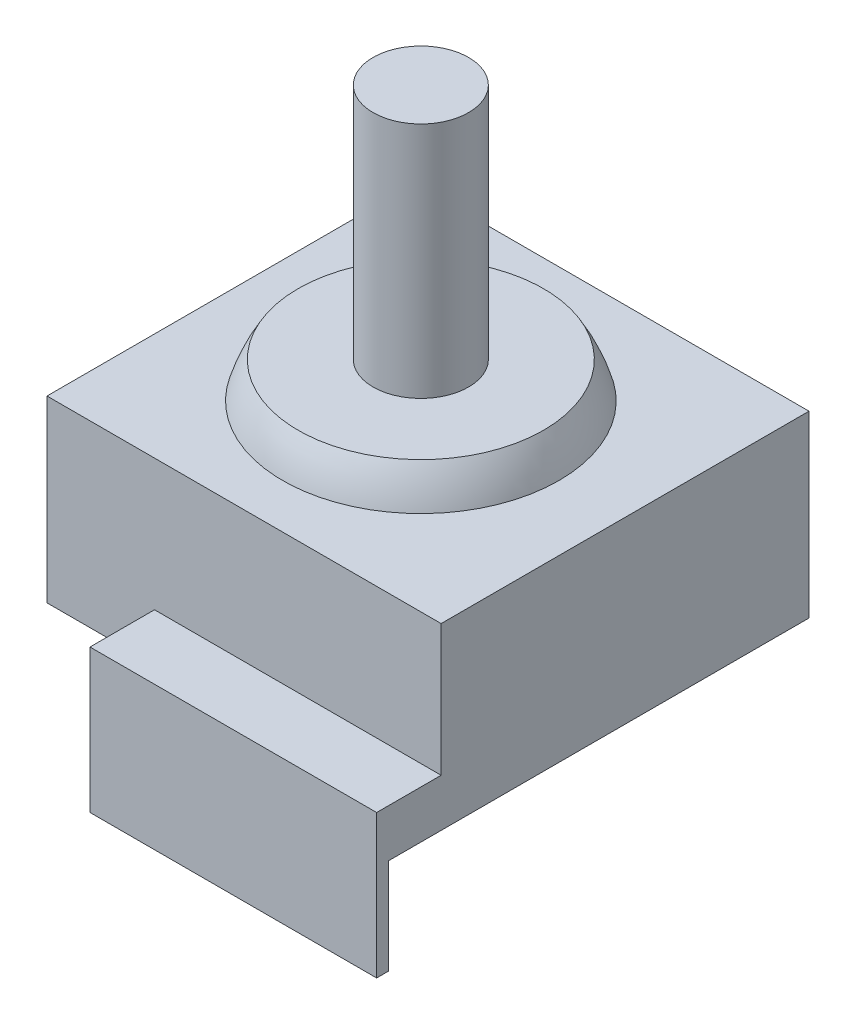
ISO-10303-21;
HEADER;
FILE_DESCRIPTION(('STEP AP214'),'2;1');
FILE_NAME('part.step','',(''),(''),'','','');
FILE_SCHEMA(('AUTOMOTIVE_DESIGN { 1 0 10303 214 1 1 1 1 }'));
ENDSEC;
DATA;
#1=APPLICATION_CONTEXT('core data for automotive mechanical design processes');
#2=APPLICATION_PROTOCOL_DEFINITION('international standard','automotive_design',2000,#1);
#3=PRODUCT_CONTEXT('',#1,'mechanical');
#4=PRODUCT('Part','Part','',(#3));
#5=PRODUCT_RELATED_PRODUCT_CATEGORY('part','',(#4));
#6=PRODUCT_DEFINITION_FORMATION('','',#4);
#7=PRODUCT_DEFINITION_CONTEXT('part definition',#1,'design');
#8=PRODUCT_DEFINITION('design','',#6,#7);
#9=PRODUCT_DEFINITION_SHAPE('','',#8);
#10=(LENGTH_UNIT() NAMED_UNIT(*) SI_UNIT(.MILLI.,.METRE.));
#11=(NAMED_UNIT(*) PLANE_ANGLE_UNIT() SI_UNIT($,.RADIAN.));
#12=(NAMED_UNIT(*) SI_UNIT($,.STERADIAN.) SOLID_ANGLE_UNIT());
#13=UNCERTAINTY_MEASURE_WITH_UNIT(LENGTH_MEASURE(1.E-05),#10,'distance_accuracy_value','');
#14=(GEOMETRIC_REPRESENTATION_CONTEXT(3) GLOBAL_UNCERTAINTY_ASSIGNED_CONTEXT((#13)) GLOBAL_UNIT_ASSIGNED_CONTEXT((#10,
#11,#12)) REPRESENTATION_CONTEXT('',''));
#15=CARTESIAN_POINT('',(0.,0.,0.));
#16=DIRECTION('',(0.,0.,1.));
#17=DIRECTION('',(1.,0.,0.));
#18=AXIS2_PLACEMENT_3D('',#15,#16,#17);
#19=CARTESIAN_POINT('',(-8.,7.5,7.65));
#20=DIRECTION('',(0.,0.,-1.));
#21=DIRECTION('',(-1.,0.,0.));
#22=AXIS2_PLACEMENT_3D('',#19,#20,#21);
#23=PLANE('',#22);
#24=DIRECTION('',(0.,-1.,0.));
#25=VECTOR('',#24,1.);
#26=CARTESIAN_POINT('',(-3.5,2.,7.65));
#27=LINE('',#26,#25);
#28=CARTESIAN_POINT('',(-3.5,2.,7.65));
#29=VERTEX_POINT('',#28);
#30=CARTESIAN_POINT('',(-3.5,0.,7.65));
#31=VERTEX_POINT('',#30);
#32=EDGE_CURVE('E117',#29,#31,#27,.T.);
#33=ORIENTED_EDGE('',*,*,#32,.F.);
#34=DIRECTION('',(1.,0.,0.));
#35=VECTOR('',#34,1.);
#36=CARTESIAN_POINT('',(8.5,2.,7.65));
#37=LINE('',#36,#35);
#38=CARTESIAN_POINT('',(8.5,2.,7.65));
#39=VERTEX_POINT('',#38);
#40=EDGE_CURVE('E153',#29,#39,#37,.T.);
#41=ORIENTED_EDGE('',*,*,#40,.T.);
#42=DIRECTION('',(0.,-1.,0.));
#43=VECTOR('',#42,1.);
#44=CARTESIAN_POINT('',(8.5,7.5,7.65));
#45=LINE('',#44,#43);
#46=CARTESIAN_POINT('',(8.5,7.5,7.65));
#47=VERTEX_POINT('',#46);
#48=EDGE_CURVE('E187',#47,#39,#45,.T.);
#49=ORIENTED_EDGE('',*,*,#48,.F.);
#50=DIRECTION('',(1.,0.,0.));
#51=VECTOR('',#50,1.);
#52=CARTESIAN_POINT('',(-8.,7.5,7.65));
#53=LINE('',#52,#51);
#54=CARTESIAN_POINT('',(-8.,7.5,7.65));
#55=VERTEX_POINT('',#54);
#56=EDGE_CURVE('E167',#55,#47,#53,.T.);
#57=ORIENTED_EDGE('',*,*,#56,.F.);
#58=DIRECTION('',(0.,-1.,0.));
#59=VECTOR('',#58,1.);
#60=CARTESIAN_POINT('',(-8.,7.5,7.65));
#61=LINE('',#60,#59);
#62=CARTESIAN_POINT('',(-8.,0.,7.65));
#63=VERTEX_POINT('',#62);
#64=EDGE_CURVE('E46',#55,#63,#61,.T.);
#65=ORIENTED_EDGE('',*,*,#64,.T.);
#66=DIRECTION('',(1.,0.,0.));
#67=VECTOR('',#66,1.);
#68=CARTESIAN_POINT('',(-8.,0.,7.65));
#69=LINE('',#68,#67);
#70=EDGE_CURVE('E177',#63,#31,#69,.T.);
#71=ORIENTED_EDGE('',*,*,#70,.T.);
#72=EDGE_LOOP('',(#33,#41,#49,#57,#65,#71));
#73=FACE_BOUND('',#72,.T.);
#74=ADVANCED_FACE('F37',(#73),#23,.F.);
#75=CARTESIAN_POINT('',(0.,7.5,0.));
#76=DIRECTION('',(0.,-1.,0.));
#77=DIRECTION('',(0.,0.,-1.));
#78=AXIS2_PLACEMENT_3D('',#75,#76,#77);
#79=PLANE('',#78);
#80=CARTESIAN_POINT('',(0.,7.5,0.));
#81=DIRECTION('',(0.,-1.,0.));
#82=DIRECTION('',(0.,0.,-1.));
#83=AXIS2_PLACEMENT_3D('',#80,#81,#82);
#84=CIRCLE('',#83,5.78273291792038);
#85=CARTESIAN_POINT('',(5.78273291792038,7.5,0.));
#86=VERTEX_POINT('',#85);
#87=EDGE_CURVE('E41',#86,#86,#84,.T.);
#88=ORIENTED_EDGE('',*,*,#87,.T.);
#89=EDGE_LOOP('',(#88));
#90=FACE_BOUND('',#89,.T.);
#91=DIRECTION('',(0.,0.,1.));
#92=VECTOR('',#91,1.);
#93=CARTESIAN_POINT('',(-8.,7.5,7.65));
#94=LINE('',#93,#92);
#95=CARTESIAN_POINT('',(-8.,7.5,-7.75));
#96=VERTEX_POINT('',#95);
#97=EDGE_CURVE('E164',#96,#55,#94,.T.);
#98=ORIENTED_EDGE('',*,*,#97,.T.);
#99=ORIENTED_EDGE('',*,*,#56,.T.);
#100=DIRECTION('',(0.,0.,-1.));
#101=VECTOR('',#100,1.);
#102=CARTESIAN_POINT('',(8.5,7.5,7.65));
#103=LINE('',#102,#101);
#104=CARTESIAN_POINT('',(8.5,7.5,-7.75));
#105=VERTEX_POINT('',#104);
#106=EDGE_CURVE('E170',#47,#105,#103,.T.);
#107=ORIENTED_EDGE('',*,*,#106,.T.);
#108=DIRECTION('',(-1.,0.,0.));
#109=VECTOR('',#108,1.);
#110=CARTESIAN_POINT('',(-8.,7.5,-7.75));
#111=LINE('',#110,#109);
#112=EDGE_CURVE('E172',#105,#96,#111,.T.);
#113=ORIENTED_EDGE('',*,*,#112,.T.);
#114=EDGE_LOOP('',(#98,#99,#107,#113));
#115=FACE_BOUND('',#114,.T.);
#116=ADVANCED_FACE('F219',(#90,#115),#79,.F.);
#117=CARTESIAN_POINT('',(0.,0.,0.));
#118=DIRECTION('',(0.,-1.,0.));
#119=DIRECTION('',(0.,0.,-1.));
#120=AXIS2_PLACEMENT_3D('',#117,#118,#119);
#121=PLANE('',#120);
#122=DIRECTION('',(1.,0.,0.));
#123=VECTOR('',#122,1.);
#124=CARTESIAN_POINT('',(0.,0.,9.85));
#125=LINE('',#124,#123);
#126=CARTESIAN_POINT('',(-3.5,0.,9.85));
#127=VERTEX_POINT('',#126);
#128=CARTESIAN_POINT('',(8.5,0.,9.85));
#129=VERTEX_POINT('',#128);
#130=EDGE_CURVE('E57',#127,#129,#125,.T.);
#131=ORIENTED_EDGE('',*,*,#130,.F.);
#132=DIRECTION('',(0.,0.,-1.));
#133=VECTOR('',#132,1.);
#134=CARTESIAN_POINT('',(-3.5,0.,7.65));
#135=LINE('',#134,#133);
#136=EDGE_CURVE('E147',#127,#31,#135,.T.);
#137=ORIENTED_EDGE('',*,*,#136,.T.);
#138=ORIENTED_EDGE('',*,*,#70,.F.);
#139=DIRECTION('',(0.,0.,1.));
#140=VECTOR('',#139,1.);
#141=CARTESIAN_POINT('',(-8.,0.,7.65));
#142=LINE('',#141,#140);
#143=CARTESIAN_POINT('',(-8.,0.,-7.75));
#144=VERTEX_POINT('',#143);
#145=EDGE_CURVE('E163',#144,#63,#142,.T.);
#146=ORIENTED_EDGE('',*,*,#145,.F.);
#147=DIRECTION('',(-1.,0.,0.));
#148=VECTOR('',#147,1.);
#149=CARTESIAN_POINT('',(-8.,0.,-7.75));
#150=LINE('',#149,#148);
#151=CARTESIAN_POINT('',(8.5,0.,-7.75));
#152=VERTEX_POINT('',#151);
#153=EDGE_CURVE('E168',#152,#144,#150,.T.);
#154=ORIENTED_EDGE('',*,*,#153,.F.);
#155=DIRECTION('',(0.,0.,-1.));
#156=VECTOR('',#155,1.);
#157=CARTESIAN_POINT('',(8.5,0.,7.65));
#158=LINE('',#157,#156);
#159=EDGE_CURVE('E53',#129,#152,#158,.T.);
#160=ORIENTED_EDGE('',*,*,#159,.F.);
#161=EDGE_LOOP('',(#131,#137,#138,#146,#154,#160));
#162=FACE_BOUND('',#161,.T.);
#163=CARTESIAN_POINT('',(0.,0.,0.));
#164=DIRECTION('',(0.,1.,0.));
#165=DIRECTION('',(0.,0.,1.));
#166=AXIS2_PLACEMENT_3D('',#163,#164,#165);
#167=CIRCLE('',#166,0.5);
#168=CARTESIAN_POINT('',(0.,0.,0.5));
#169=VERTEX_POINT('',#168);
#170=EDGE_CURVE('E158',#169,#169,#167,.T.);
#171=ORIENTED_EDGE('',*,*,#170,.T.);
#172=EDGE_LOOP('',(#171));
#173=FACE_BOUND('',#172,.T.);
#174=ADVANCED_FACE('F225',(#162,#173),#121,.T.);
#175=CARTESIAN_POINT('',(-8.,7.5,7.65));
#176=DIRECTION('',(1.,0.,0.));
#177=DIRECTION('',(0.,0.,-1.));
#178=AXIS2_PLACEMENT_3D('',#175,#176,#177);
#179=PLANE('',#178);
#180=ORIENTED_EDGE('',*,*,#145,.T.);
#181=ORIENTED_EDGE('',*,*,#64,.F.);
#182=ORIENTED_EDGE('',*,*,#97,.F.);
#183=DIRECTION('',(0.,-1.,0.));
#184=VECTOR('',#183,1.);
#185=CARTESIAN_POINT('',(-8.,7.5,-7.75));
#186=LINE('',#185,#184);
#187=EDGE_CURVE('E174',#96,#144,#186,.T.);
#188=ORIENTED_EDGE('',*,*,#187,.T.);
#189=EDGE_LOOP('',(#180,#181,#182,#188));
#190=FACE_BOUND('',#189,.T.);
#191=ADVANCED_FACE('F39',(#190),#179,.F.);
#192=CARTESIAN_POINT('',(8.5,7.5,7.65));
#193=DIRECTION('',(-1.,0.,0.));
#194=DIRECTION('',(0.,0.,1.));
#195=AXIS2_PLACEMENT_3D('',#192,#193,#194);
#196=PLANE('',#195);
#197=DIRECTION('',(0.,0.,1.));
#198=VECTOR('',#197,1.);
#199=CARTESIAN_POINT('',(8.5,2.,7.65));
#200=LINE('',#199,#198);
#201=CARTESIAN_POINT('',(8.5,2.,10.35));
#202=VERTEX_POINT('',#201);
#203=EDGE_CURVE('E148',#39,#202,#200,.T.);
#204=ORIENTED_EDGE('',*,*,#203,.T.);
#205=DIRECTION('',(0.,-1.,0.));
#206=VECTOR('',#205,1.);
#207=CARTESIAN_POINT('',(8.5,2.,10.35));
#208=LINE('',#207,#206);
#209=CARTESIAN_POINT('',(8.5,-4.,10.35));
#210=VERTEX_POINT('',#209);
#211=EDGE_CURVE('E118',#202,#210,#208,.T.);
#212=ORIENTED_EDGE('',*,*,#211,.T.);
#213=DIRECTION('',(0.,0.,-1.));
#214=VECTOR('',#213,1.);
#215=CARTESIAN_POINT('',(8.5,-4.,10.35));
#216=LINE('',#215,#214);
#217=CARTESIAN_POINT('',(8.5,-4.,9.85));
#218=VERTEX_POINT('',#217);
#219=EDGE_CURVE('E128',#210,#218,#216,.T.);
#220=ORIENTED_EDGE('',*,*,#219,.T.);
#221=DIRECTION('',(0.,1.,0.));
#222=VECTOR('',#221,1.);
#223=CARTESIAN_POINT('',(8.5,-4.,9.85));
#224=LINE('',#223,#222);
#225=EDGE_CURVE('E142',#218,#129,#224,.T.);
#226=ORIENTED_EDGE('',*,*,#225,.T.);
#227=ORIENTED_EDGE('',*,*,#159,.T.);
#228=DIRECTION('',(0.,-1.,0.));
#229=VECTOR('',#228,1.);
#230=CARTESIAN_POINT('',(8.5,7.5,-7.75));
#231=LINE('',#230,#229);
#232=EDGE_CURVE('E184',#105,#152,#231,.T.);
#233=ORIENTED_EDGE('',*,*,#232,.F.);
#234=ORIENTED_EDGE('',*,*,#106,.F.);
#235=ORIENTED_EDGE('',*,*,#48,.T.);
#236=EDGE_LOOP('',(#204,#212,#220,#226,#227,#233,#234,#235));
#237=FACE_BOUND('',#236,.T.);
#238=ADVANCED_FACE('F230',(#237),#196,.F.);
#239=CARTESIAN_POINT('',(-8.,7.5,-7.75));
#240=DIRECTION('',(0.,0.,1.));
#241=DIRECTION('',(1.,0.,0.));
#242=AXIS2_PLACEMENT_3D('',#239,#240,#241);
#243=PLANE('',#242);
#244=ORIENTED_EDGE('',*,*,#153,.T.);
#245=ORIENTED_EDGE('',*,*,#187,.F.);
#246=ORIENTED_EDGE('',*,*,#112,.F.);
#247=ORIENTED_EDGE('',*,*,#232,.T.);
#248=EDGE_LOOP('',(#244,#245,#246,#247));
#249=FACE_BOUND('',#248,.T.);
#250=ADVANCED_FACE('F233',(#249),#243,.F.);
#251=CARTESIAN_POINT('',(0.,7.5,0.));
#252=DIRECTION('',(0.,-1.,0.));
#253=DIRECTION('',(0.,0.,-1.));
#254=AXIS2_PLACEMENT_3D('',#251,#252,#253);
#255=CYLINDRICAL_SURFACE('',#254,0.5);
#256=CARTESIAN_POINT('',(0.,5.9,0.));
#257=DIRECTION('',(0.,-1.,0.));
#258=DIRECTION('',(0.,0.,-1.));
#259=AXIS2_PLACEMENT_3D('',#256,#257,#258);
#260=CIRCLE('',#259,0.5);
#261=CARTESIAN_POINT('',(0.,5.9,-0.5));
#262=VERTEX_POINT('',#261);
#263=EDGE_CURVE('E11',#262,#262,#260,.T.);
#264=ORIENTED_EDGE('',*,*,#263,.F.);
#265=EDGE_LOOP('',(#264));
#266=FACE_BOUND('',#265,.T.);
#267=ORIENTED_EDGE('',*,*,#170,.F.);
#268=EDGE_LOOP('',(#267));
#269=FACE_BOUND('',#268,.T.);
#270=ADVANCED_FACE('F237',(#266,#269),#255,.F.);
#271=CARTESIAN_POINT('',(-3.5,2.,7.65));
#272=DIRECTION('',(-1.,0.,0.));
#273=DIRECTION('',(0.,0.,1.));
#274=AXIS2_PLACEMENT_3D('',#271,#272,#273);
#275=PLANE('',#274);
#276=ORIENTED_EDGE('',*,*,#136,.F.);
#277=DIRECTION('',(0.,1.,0.));
#278=VECTOR('',#277,1.);
#279=CARTESIAN_POINT('',(-3.5,-4.,9.85));
#280=LINE('',#279,#278);
#281=CARTESIAN_POINT('',(-3.5,-4.,9.85));
#282=VERTEX_POINT('',#281);
#283=EDGE_CURVE('E132',#282,#127,#280,.T.);
#284=ORIENTED_EDGE('',*,*,#283,.F.);
#285=DIRECTION('',(0.,0.,1.));
#286=VECTOR('',#285,1.);
#287=CARTESIAN_POINT('',(-3.5,-4.,10.35));
#288=LINE('',#287,#286);
#289=CARTESIAN_POINT('',(-3.5,-4.,10.35));
#290=VERTEX_POINT('',#289);
#291=EDGE_CURVE('E125',#282,#290,#288,.T.);
#292=ORIENTED_EDGE('',*,*,#291,.T.);
#293=DIRECTION('',(0.,-1.,0.));
#294=VECTOR('',#293,1.);
#295=CARTESIAN_POINT('',(-3.5,2.,10.35));
#296=LINE('',#295,#294);
#297=CARTESIAN_POINT('',(-3.5,2.,10.35));
#298=VERTEX_POINT('',#297);
#299=EDGE_CURVE('E107',#298,#290,#296,.T.);
#300=ORIENTED_EDGE('',*,*,#299,.F.);
#301=DIRECTION('',(0.,0.,-1.));
#302=VECTOR('',#301,1.);
#303=CARTESIAN_POINT('',(-3.5,2.,7.65));
#304=LINE('',#303,#302);
#305=EDGE_CURVE('E151',#298,#29,#304,.T.);
#306=ORIENTED_EDGE('',*,*,#305,.T.);
#307=ORIENTED_EDGE('',*,*,#32,.T.);
#308=EDGE_LOOP('',(#276,#284,#292,#300,#306,#307));
#309=FACE_BOUND('',#308,.T.);
#310=ADVANCED_FACE('F130',(#309),#275,.T.);
#311=CARTESIAN_POINT('',(8.5,2.,10.35));
#312=DIRECTION('',(0.,0.,1.));
#313=DIRECTION('',(1.,0.,0.));
#314=AXIS2_PLACEMENT_3D('',#311,#312,#313);
#315=PLANE('',#314);
#316=ORIENTED_EDGE('',*,*,#299,.T.);
#317=DIRECTION('',(1.,0.,0.));
#318=VECTOR('',#317,1.);
#319=CARTESIAN_POINT('',(-3.5,-4.,10.35));
#320=LINE('',#319,#318);
#321=EDGE_CURVE('E111',#290,#210,#320,.T.);
#322=ORIENTED_EDGE('',*,*,#321,.T.);
#323=ORIENTED_EDGE('',*,*,#211,.F.);
#324=DIRECTION('',(-1.,0.,0.));
#325=VECTOR('',#324,1.);
#326=CARTESIAN_POINT('',(8.5,2.,10.35));
#327=LINE('',#326,#325);
#328=EDGE_CURVE('E113',#202,#298,#327,.T.);
#329=ORIENTED_EDGE('',*,*,#328,.T.);
#330=EDGE_LOOP('',(#316,#322,#323,#329));
#331=FACE_BOUND('',#330,.T.);
#332=ADVANCED_FACE('F109',(#331),#315,.T.);
#333=CARTESIAN_POINT('',(0.,2.,0.));
#334=DIRECTION('',(0.,-1.,0.));
#335=DIRECTION('',(0.,0.,-1.));
#336=AXIS2_PLACEMENT_3D('',#333,#334,#335);
#337=PLANE('',#336);
#338=ORIENTED_EDGE('',*,*,#40,.F.);
#339=ORIENTED_EDGE('',*,*,#305,.F.);
#340=ORIENTED_EDGE('',*,*,#328,.F.);
#341=ORIENTED_EDGE('',*,*,#203,.F.);
#342=EDGE_LOOP('',(#338,#339,#340,#341));
#343=FACE_BOUND('',#342,.T.);
#344=ADVANCED_FACE('F246',(#343),#337,.F.);
#345=CARTESIAN_POINT('',(-3.5,-4.,9.85));
#346=DIRECTION('',(0.,0.,-1.));
#347=DIRECTION('',(-1.,0.,0.));
#348=AXIS2_PLACEMENT_3D('',#345,#346,#347);
#349=PLANE('',#348);
#350=ORIENTED_EDGE('',*,*,#283,.T.);
#351=ORIENTED_EDGE('',*,*,#130,.T.);
#352=ORIENTED_EDGE('',*,*,#225,.F.);
#353=DIRECTION('',(-1.,0.,0.));
#354=VECTOR('',#353,1.);
#355=CARTESIAN_POINT('',(-3.5,-4.,9.85));
#356=LINE('',#355,#354);
#357=EDGE_CURVE('E140',#218,#282,#356,.T.);
#358=ORIENTED_EDGE('',*,*,#357,.T.);
#359=EDGE_LOOP('',(#350,#351,#352,#358));
#360=FACE_BOUND('',#359,.T.);
#361=ADVANCED_FACE('F215',(#360),#349,.T.);
#362=CARTESIAN_POINT('',(0.,-4.,0.));
#363=DIRECTION('',(0.,-1.,0.));
#364=DIRECTION('',(0.,0.,-1.));
#365=AXIS2_PLACEMENT_3D('',#362,#363,#364);
#366=PLANE('',#365);
#367=ORIENTED_EDGE('',*,*,#291,.F.);
#368=ORIENTED_EDGE('',*,*,#357,.F.);
#369=ORIENTED_EDGE('',*,*,#219,.F.);
#370=ORIENTED_EDGE('',*,*,#321,.F.);
#371=EDGE_LOOP('',(#367,#368,#369,#370));
#372=FACE_BOUND('',#371,.T.);
#373=ADVANCED_FACE('F123',(#372),#366,.T.);
#374=CARTESIAN_POINT('',(0.,9.,0.));
#375=DIRECTION('',(0.,1.,0.));
#376=DIRECTION('',(0.,0.,1.));
#377=AXIS2_PLACEMENT_3D('',#374,#375,#376);
#378=PLANE('',#377);
#379=CARTESIAN_POINT('',(0.,9.,0.));
#380=DIRECTION('',(0.,1.,0.));
#381=DIRECTION('',(0.,0.,1.));
#382=AXIS2_PLACEMENT_3D('',#379,#380,#381);
#383=CIRCLE('',#382,2.);
#384=CARTESIAN_POINT('',(0.,9.,2.));
#385=VERTEX_POINT('',#384);
#386=EDGE_CURVE('E192',#385,#385,#383,.T.);
#387=ORIENTED_EDGE('',*,*,#386,.F.);
#388=EDGE_LOOP('',(#387));
#389=FACE_BOUND('',#388,.T.);
#390=CARTESIAN_POINT('',(0.,9.,0.));
#391=DIRECTION('',(0.,-1.,0.));
#392=DIRECTION('',(0.,0.,-1.));
#393=AXIS2_PLACEMENT_3D('',#390,#391,#392);
#394=CIRCLE('',#393,5.13711981561653);
#395=CARTESIAN_POINT('',(5.13711981561653,9.,0.));
#396=VERTEX_POINT('',#395);
#397=EDGE_CURVE('E194',#396,#396,#394,.T.);
#398=ORIENTED_EDGE('',*,*,#397,.F.);
#399=EDGE_LOOP('',(#398));
#400=FACE_BOUND('',#399,.T.);
#401=ADVANCED_FACE('F204',(#389,#400),#378,.T.);
#402=CARTESIAN_POINT('',(0.,5.9,0.));
#403=DIRECTION('',(0.,-1.,0.));
#404=DIRECTION('',(1.,0.,0.));
#405=AXIS2_PLACEMENT_3D('',#402,#403,#404);
#406=SPHERICAL_SURFACE('',#405,6.);
#407=CARTESIAN_POINT('',(5.13711981561653,9.,0.));
#408=CARTESIAN_POINT('',(5.14593609870219,8.98539022867018,0.));
#409=CARTESIAN_POINT('',(5.15469005412287,8.97074284568255,0.));
#410=CARTESIAN_POINT('',(5.1720726796035,8.94137392687018,0.));
#411=CARTESIAN_POINT('',(5.18070134966345,8.92665239104544,0.));
#412=CARTESIAN_POINT('',(5.19783277439181,8.89713623703743,0.));
#413=CARTESIAN_POINT('',(5.20633552906023,8.88234161885415,0.));
#414=CARTESIAN_POINT('',(5.22321450458411,8.85268037737378,0.));
#415=CARTESIAN_POINT('',(5.23159072543958,8.83781375407668,0.));
#416=CARTESIAN_POINT('',(5.24821602347208,8.80800958446732,0.));
#417=CARTESIAN_POINT('',(5.25646510064912,8.79307203815505,0.));
#418=CARTESIAN_POINT('',(5.27283551088986,8.76312710988048,0.));
#419=CARTESIAN_POINT('',(5.28095684395357,8.74811972791817,0.));
#420=CARTESIAN_POINT('',(5.29707117478458,8.71803622076438,0.));
#421=CARTESIAN_POINT('',(5.30506417255187,8.70296009557289,0.));
#422=CARTESIAN_POINT('',(5.32092125096143,8.67274019939302,0.));
#423=CARTESIAN_POINT('',(5.32878533160368,8.65759642840464,0.));
#424=CARTESIAN_POINT('',(5.34438400331538,8.62724234298541,0.));
#425=CARTESIAN_POINT('',(5.35211859438481,8.61203202855456,0.));
#426=CARTESIAN_POINT('',(5.36745772392986,8.5815459634492,0.));
#427=CARTESIAN_POINT('',(5.37506226240548,8.56627021277471,0.));
#428=CARTESIAN_POINT('',(5.39014073320853,8.53565438714401,0.));
#429=CARTESIAN_POINT('',(5.39761466553596,8.52031431218782,0.));
#430=CARTESIAN_POINT('',(5.41243137999551,8.48957095463807,0.));
#431=CARTESIAN_POINT('',(5.41977416212762,8.47416767204451,0.));
#432=CARTESIAN_POINT('',(5.43432804169614,8.4432990204654,0.));
#433=CARTESIAN_POINT('',(5.44153913913254,8.42783365147984,0.));
#434=CARTESIAN_POINT('',(5.45582912439493,8.39684195288154,0.));
#435=CARTESIAN_POINT('',(5.46290801222091,8.38131562326879,0.));
#436=CARTESIAN_POINT('',(5.47693306297164,8.35020313361837,0.));
#437=CARTESIAN_POINT('',(5.48387922589638,8.33461697358071,0.));
#438=CARTESIAN_POINT('',(5.49763832121519,8.30338595763797,0.));
#439=CARTESIAN_POINT('',(5.50445125360926,8.2877411017329,0.));
#440=CARTESIAN_POINT('',(5.51794339193549,8.25639383288547,0.));
#441=CARTESIAN_POINT('',(5.52462259786765,8.2406914199431,0.));
#442=CARTESIAN_POINT('',(5.53784679707314,8.20923018004095,0.));
#443=CARTESIAN_POINT('',(5.54439179034647,8.19347135308115,0.));
#444=CARTESIAN_POINT('',(5.55734708780705,8.1618984322705,0.));
#445=CARTESIAN_POINT('',(5.5637573919943,8.14608433841965,0.));
#446=CARTESIAN_POINT('',(5.57644284465985,8.11440203497629,0.));
#447=CARTESIAN_POINT('',(5.58271799313816,8.09853382538378,0.));
#448=CARTESIAN_POINT('',(5.59513267760131,8.06674444554572,0.));
#449=CARTESIAN_POINT('',(5.60127221358614,8.05082327530018,0.));
#450=CARTESIAN_POINT('',(5.61341522614941,8.01892913309983,0.));
#451=CARTESIAN_POINT('',(5.61941870272784,8.00295616114503,0.));
#452=CARTESIAN_POINT('',(5.63128915946946,7.97095957824071,0.));
#453=CARTESIAN_POINT('',(5.63715613963265,7.9549359672912,0.));
#454=CARTESIAN_POINT('',(5.64875317647096,7.92283927279818,0.));
#455=CARTESIAN_POINT('',(5.65448323314608,7.90676618925467,0.));
#456=CARTESIAN_POINT('',(5.66580600590217,7.87457171957553,0.));
#457=CARTESIAN_POINT('',(5.67139872198315,7.8584503334399,0.));
#458=CARTESIAN_POINT('',(5.68244640644327,7.82616043209477,0.));
#459=CARTESIAN_POINT('',(5.68790137482241,7.80999191688526,0.));
#460=CARTESIAN_POINT('',(5.69867316679442,7.77760893434018,0.));
#461=CARTESIAN_POINT('',(5.70398999038729,7.7613944670046,0.));
#462=CARTESIAN_POINT('',(5.71448510577231,7.72892076050419,0.));
#463=CARTESIAN_POINT('',(5.71966339756445,7.71266152133935,0.));
#464=CARTESIAN_POINT('',(5.72988107236516,7.68009945472127,0.));
#465=CARTESIAN_POINT('',(5.73492045537372,7.66379662726803,0.));
#466=CARTESIAN_POINT('',(5.74485994593192,7.63114857084293,0.));
#467=CARTESIAN_POINT('',(5.74976005348157,7.61480334187108,0.));
#468=CARTESIAN_POINT('',(5.75942063585329,7.58207167205594,0.));
#469=CARTESIAN_POINT('',(5.76418111067537,7.56568523121265,0.));
#470=CARTESIAN_POINT('',(5.77356208321776,7.53287233108226,0.));
#471=CARTESIAN_POINT('',(5.77818258093806,7.51644587179517,0.));
#472=CARTESIAN_POINT('',(5.78273291792038,7.5,0.));
#473=B_SPLINE_CURVE_WITH_KNOTS('',3,(#407,#408,#409,#410,#411,#412,#413,#414,#415,#416,#417,
#418,#419,#420,#421,#422,#423,#424,#425,#426,#427,#428,#429,#430,#431,#432,#433,#434,#435,#436,
#437,#438,#439,#440,#441,#442,#443,#444,#445,#446,#447,#448,#449,#450,#451,#452,#453,#454,#455,
#456,#457,#458,#459,#460,#461,#462,#463,#464,#465,#466,#467,#468,#469,#470,#471,#472),
.UNSPECIFIED.,.F.,.F.,(4,2,2,2,2,2,2,2,2,2,2,2,2,2,2,2,2,2,2,2,2,2,2,2,2,2,2,2,2,2,2,2,4),(0.,
0.0511911563702004,0.102382312740401,0.1535734691106,0.2047646254808,0.255955781851,
0.307146938221199,0.3583380945914,0.4095292509616,0.4607204073318,0.511911563701998,
0.5631027200722,0.614293876442399,0.665485032812599,0.716676189182798,0.767867345552999,
0.819058501923198,0.870249658293399,0.921440814663598,0.972631971033798,1.023823127404,
1.0750142837742,1.1262054401444,1.1773965965146,1.2285877528848,1.279778909255,1.3309700656252,
1.3821612219954,1.4333523783656,1.4845435347358,1.535734691106,1.5869258474762,1.6381170038464),.UNSPECIFIED.);
#474=EDGE_CURVE('BSEAM201',#396,#86,#473,.T.);
#475=ORIENTED_EDGE('',*,*,#397,.T.);
#476=ORIENTED_EDGE('',*,*,#87,.F.);
#477=ORIENTED_EDGE('',*,*,#474,.T.);
#478=ORIENTED_EDGE('',*,*,#474,.F.);
#479=EDGE_LOOP('',(#475,#477,#476,#478));
#480=FACE_BOUND('',#479,.T.);
#481=ADVANCED_FACE('F201',(#480),#406,.T.);
#482=CARTESIAN_POINT('',(0.,5.9,0.));
#483=DIRECTION('',(0.,-1.,0.));
#484=DIRECTION('',(0.,0.,-1.));
#485=AXIS2_PLACEMENT_3D('',#482,#483,#484);
#486=PLANE('',#485);
#487=ORIENTED_EDGE('',*,*,#263,.T.);
#488=EDGE_LOOP('',(#487));
#489=FACE_BOUND('',#488,.T.);
#490=ADVANCED_FACE('F212',(#489),#486,.T.);
#491=CARTESIAN_POINT('',(0.,18.95,0.));
#492=DIRECTION('',(0.,1.,0.));
#493=DIRECTION('',(0.,0.,1.));
#494=AXIS2_PLACEMENT_3D('',#491,#492,#493);
#495=PLANE('',#494);
#496=CARTESIAN_POINT('',(0.,18.95,0.));
#497=DIRECTION('',(0.,1.,0.));
#498=DIRECTION('',(0.,0.,1.));
#499=AXIS2_PLACEMENT_3D('',#496,#497,#498);
#500=CIRCLE('',#499,2.);
#501=CARTESIAN_POINT('',(0.,18.95,2.));
#502=VERTEX_POINT('',#501);
#503=EDGE_CURVE('E133',#502,#502,#500,.T.);
#504=ORIENTED_EDGE('',*,*,#503,.T.);
#505=EDGE_LOOP('',(#504));
#506=FACE_BOUND('',#505,.T.);
#507=ADVANCED_FACE('F257',(#506),#495,.T.);
#508=CARTESIAN_POINT('',(0.,18.95,0.));
#509=DIRECTION('',(0.,-1.,0.));
#510=DIRECTION('',(0.,0.,-1.));
#511=AXIS2_PLACEMENT_3D('',#508,#509,#510);
#512=CYLINDRICAL_SURFACE('',#511,2.);
#513=ORIENTED_EDGE('',*,*,#386,.T.);
#514=EDGE_LOOP('',(#513));
#515=FACE_BOUND('',#514,.T.);
#516=ORIENTED_EDGE('',*,*,#503,.F.);
#517=EDGE_LOOP('',(#516));
#518=FACE_BOUND('',#517,.T.);
#519=ADVANCED_FACE('F255',(#515,#518),#512,.T.);
#520=CLOSED_SHELL('',(#74,#116,#174,#191,#238,#250,#270,#310,#332,#344,#361,#373,#401,#481,#490,
#507,#519));
#521=MANIFOLD_SOLID_BREP('B2',#520);
#522=ADVANCED_BREP_SHAPE_REPRESENTATION('',(#18,#521),#14);
#523=SHAPE_DEFINITION_REPRESENTATION(#9,#522);
ENDSEC;
END-ISO-10303-21;
